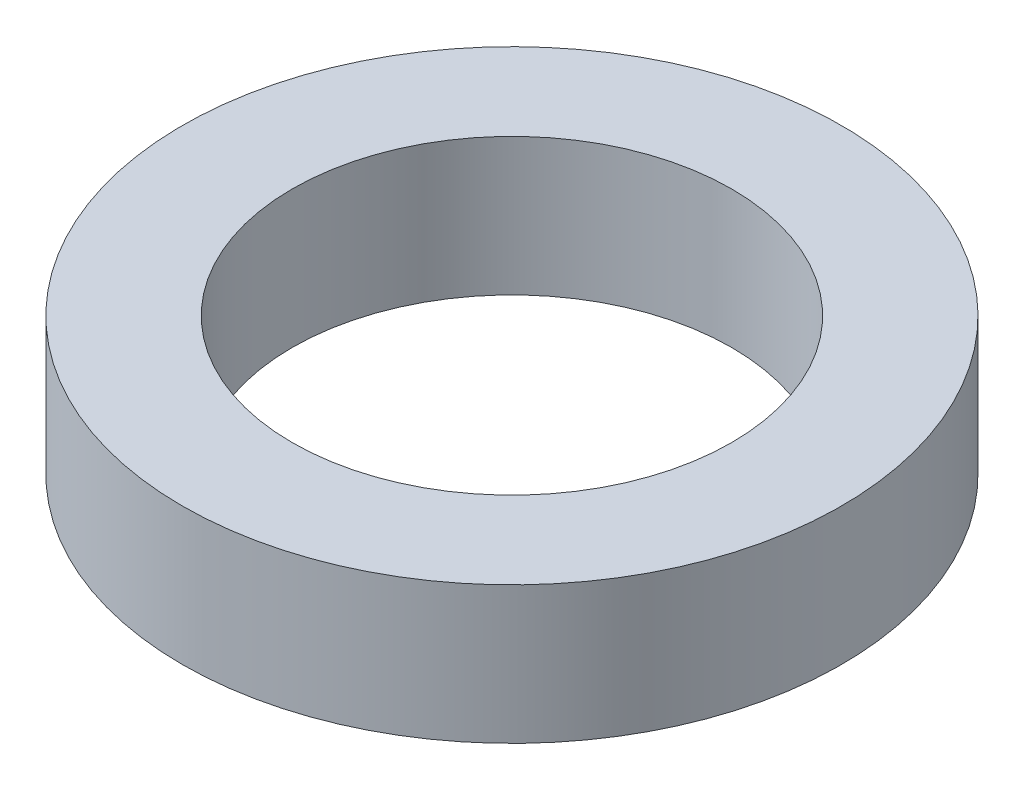
ISO-10303-21;
HEADER;
FILE_DESCRIPTION(('STEP AP214'),'2;1');
FILE_NAME('part.step','',(''),(''),'','','');
FILE_SCHEMA(('AUTOMOTIVE_DESIGN { 1 0 10303 214 1 1 1 1 }'));
ENDSEC;
DATA;
#1=APPLICATION_CONTEXT('core data for automotive mechanical design processes');
#2=APPLICATION_PROTOCOL_DEFINITION('international standard','automotive_design',2000,#1);
#3=PRODUCT_CONTEXT('',#1,'mechanical');
#4=PRODUCT('Part','Part','',(#3));
#5=PRODUCT_RELATED_PRODUCT_CATEGORY('part','',(#4));
#6=PRODUCT_DEFINITION_FORMATION('','',#4);
#7=PRODUCT_DEFINITION_CONTEXT('part definition',#1,'design');
#8=PRODUCT_DEFINITION('design','',#6,#7);
#9=PRODUCT_DEFINITION_SHAPE('','',#8);
#10=(LENGTH_UNIT() NAMED_UNIT(*) SI_UNIT(.MILLI.,.METRE.));
#11=(NAMED_UNIT(*) PLANE_ANGLE_UNIT() SI_UNIT($,.RADIAN.));
#12=(NAMED_UNIT(*) SI_UNIT($,.STERADIAN.) SOLID_ANGLE_UNIT());
#13=UNCERTAINTY_MEASURE_WITH_UNIT(LENGTH_MEASURE(1.E-05),#10,'distance_accuracy_value','');
#14=(GEOMETRIC_REPRESENTATION_CONTEXT(3) GLOBAL_UNCERTAINTY_ASSIGNED_CONTEXT((#13)) GLOBAL_UNIT_ASSIGNED_CONTEXT((#10,
#11,#12)) REPRESENTATION_CONTEXT('',''));
#15=CARTESIAN_POINT('',(0.,0.,0.));
#16=DIRECTION('',(0.,0.,1.));
#17=DIRECTION('',(1.,0.,0.));
#18=AXIS2_PLACEMENT_3D('',#15,#16,#17);
#19=CARTESIAN_POINT('',(0.,3.96875,0.));
#20=DIRECTION('',(0.,1.,0.));
#21=DIRECTION('',(0.,0.,1.));
#22=AXIS2_PLACEMENT_3D('',#19,#20,#21);
#23=PLANE('',#22);
#24=CARTESIAN_POINT('',(0.,3.96875,0.));
#25=DIRECTION('',(0.,1.,0.));
#26=DIRECTION('',(0.,0.,1.));
#27=AXIS2_PLACEMENT_3D('',#24,#25,#26);
#28=CIRCLE('',#27,9.525);
#29=CARTESIAN_POINT('',(0.,3.96875,9.525));
#30=VERTEX_POINT('',#29);
#31=EDGE_CURVE('E10',#30,#30,#28,.T.);
#32=ORIENTED_EDGE('',*,*,#31,.T.);
#33=EDGE_LOOP('',(#32));
#34=FACE_BOUND('',#33,.T.);
#35=CARTESIAN_POINT('',(0.,3.96875,0.));
#36=DIRECTION('',(0.,1.,0.));
#37=DIRECTION('',(0.,0.,1.));
#38=AXIS2_PLACEMENT_3D('',#35,#36,#37);
#39=CIRCLE('',#38,6.35);
#40=CARTESIAN_POINT('',(0.,3.96875,6.35));
#41=VERTEX_POINT('',#40);
#42=EDGE_CURVE('E50',#41,#41,#39,.T.);
#43=ORIENTED_EDGE('',*,*,#42,.F.);
#44=EDGE_LOOP('',(#43));
#45=FACE_BOUND('',#44,.T.);
#46=ADVANCED_FACE('F37',(#34,#45),#23,.T.);
#47=CARTESIAN_POINT('',(0.,0.,0.));
#48=DIRECTION('',(0.,1.,0.));
#49=DIRECTION('',(0.,0.,1.));
#50=AXIS2_PLACEMENT_3D('',#47,#48,#49);
#51=PLANE('',#50);
#52=CARTESIAN_POINT('',(0.,0.,0.));
#53=DIRECTION('',(0.,1.,0.));
#54=DIRECTION('',(0.,0.,1.));
#55=AXIS2_PLACEMENT_3D('',#52,#53,#54);
#56=CIRCLE('',#55,9.525);
#57=CARTESIAN_POINT('',(0.,0.,9.525));
#58=VERTEX_POINT('',#57);
#59=EDGE_CURVE('E41',#58,#58,#56,.T.);
#60=ORIENTED_EDGE('',*,*,#59,.F.);
#61=EDGE_LOOP('',(#60));
#62=FACE_BOUND('',#61,.T.);
#63=CARTESIAN_POINT('',(0.,0.,0.));
#64=DIRECTION('',(0.,1.,0.));
#65=DIRECTION('',(0.,0.,1.));
#66=AXIS2_PLACEMENT_3D('',#63,#64,#65);
#67=CIRCLE('',#66,6.35);
#68=CARTESIAN_POINT('',(0.,0.,6.35));
#69=VERTEX_POINT('',#68);
#70=EDGE_CURVE('E52',#69,#69,#67,.T.);
#71=ORIENTED_EDGE('',*,*,#70,.T.);
#72=EDGE_LOOP('',(#71));
#73=FACE_BOUND('',#72,.T.);
#74=ADVANCED_FACE('F64',(#62,#73),#51,.F.);
#75=CARTESIAN_POINT('',(0.,3.96875,0.));
#76=DIRECTION('',(0.,-1.,0.));
#77=DIRECTION('',(0.,0.,-1.));
#78=AXIS2_PLACEMENT_3D('',#75,#76,#77);
#79=CYLINDRICAL_SURFACE('',#78,9.525);
#80=ORIENTED_EDGE('',*,*,#31,.F.);
#81=EDGE_LOOP('',(#80));
#82=FACE_BOUND('',#81,.T.);
#83=ORIENTED_EDGE('',*,*,#59,.T.);
#84=EDGE_LOOP('',(#83));
#85=FACE_BOUND('',#84,.T.);
#86=ADVANCED_FACE('F39',(#82,#85),#79,.T.);
#87=CARTESIAN_POINT('',(0.,3.96875,0.));
#88=DIRECTION('',(0.,-1.,0.));
#89=DIRECTION('',(0.,0.,-1.));
#90=AXIS2_PLACEMENT_3D('',#87,#88,#89);
#91=CYLINDRICAL_SURFACE('',#90,6.35);
#92=ORIENTED_EDGE('',*,*,#42,.T.);
#93=EDGE_LOOP('',(#92));
#94=FACE_BOUND('',#93,.T.);
#95=ORIENTED_EDGE('',*,*,#70,.F.);
#96=EDGE_LOOP('',(#95));
#97=FACE_BOUND('',#96,.T.);
#98=ADVANCED_FACE('F60',(#94,#97),#91,.F.);
#99=CLOSED_SHELL('',(#46,#74,#86,#98));
#100=MANIFOLD_SOLID_BREP('B2',#99);
#101=ADVANCED_BREP_SHAPE_REPRESENTATION('',(#18,#100),#14);
#102=SHAPE_DEFINITION_REPRESENTATION(#9,#101);
ENDSEC;
END-ISO-10303-21;
